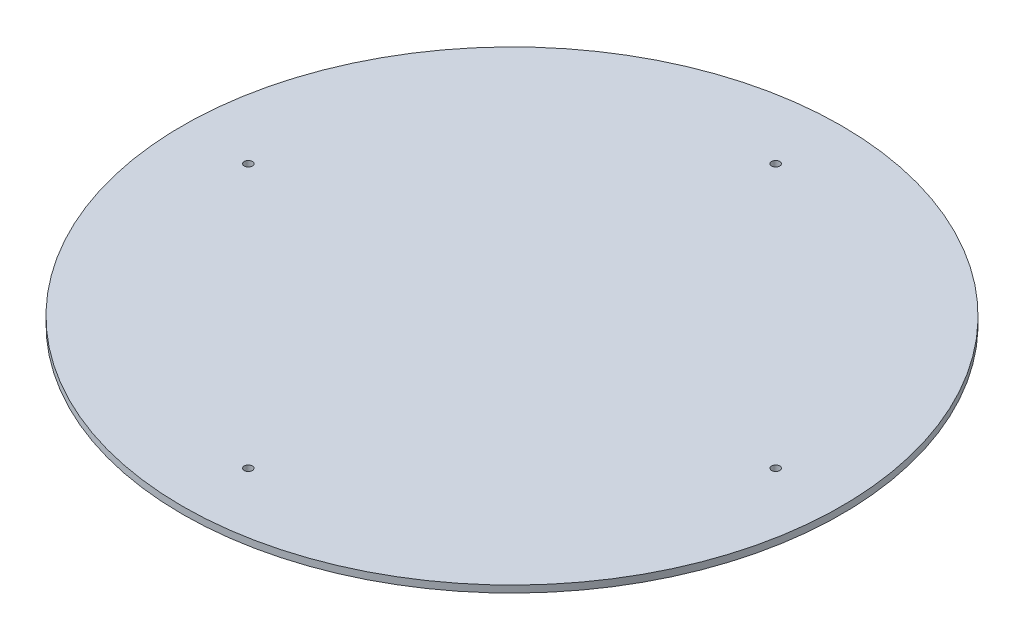
ISO-10303-21;
HEADER;
FILE_DESCRIPTION(('STEP AP214'),'2;1');
FILE_NAME('part.step','',(''),(''),'','','');
FILE_SCHEMA(('AUTOMOTIVE_DESIGN { 1 0 10303 214 1 1 1 1 }'));
ENDSEC;
DATA;
#1=APPLICATION_CONTEXT('core data for automotive mechanical design processes');
#2=APPLICATION_PROTOCOL_DEFINITION('international standard','automotive_design',2000,#1);
#3=PRODUCT_CONTEXT('',#1,'mechanical');
#4=PRODUCT('Part','Part','',(#3));
#5=PRODUCT_RELATED_PRODUCT_CATEGORY('part','',(#4));
#6=PRODUCT_DEFINITION_FORMATION('','',#4);
#7=PRODUCT_DEFINITION_CONTEXT('part definition',#1,'design');
#8=PRODUCT_DEFINITION('design','',#6,#7);
#9=PRODUCT_DEFINITION_SHAPE('','',#8);
#10=(LENGTH_UNIT() NAMED_UNIT(*) SI_UNIT(.MILLI.,.METRE.));
#11=(NAMED_UNIT(*) PLANE_ANGLE_UNIT() SI_UNIT($,.RADIAN.));
#12=(NAMED_UNIT(*) SI_UNIT($,.STERADIAN.) SOLID_ANGLE_UNIT());
#13=UNCERTAINTY_MEASURE_WITH_UNIT(LENGTH_MEASURE(1.E-05),#10,'distance_accuracy_value','');
#14=(GEOMETRIC_REPRESENTATION_CONTEXT(3) GLOBAL_UNCERTAINTY_ASSIGNED_CONTEXT((#13)) GLOBAL_UNIT_ASSIGNED_CONTEXT((#10,
#11,#12)) REPRESENTATION_CONTEXT('',''));
#15=CARTESIAN_POINT('',(0.,0.,0.));
#16=DIRECTION('',(0.,0.,1.));
#17=DIRECTION('',(1.,0.,0.));
#18=AXIS2_PLACEMENT_3D('',#15,#16,#17);
#19=CARTESIAN_POINT('',(0.,6.,0.));
#20=DIRECTION('',(0.,-1.,0.));
#21=DIRECTION('',(0.,0.,-1.));
#22=AXIS2_PLACEMENT_3D('',#19,#20,#21);
#23=CYLINDRICAL_SURFACE('',#22,285.);
#24=CARTESIAN_POINT('',(0.,6.,0.));
#25=DIRECTION('',(0.,1.,0.));
#26=DIRECTION('',(0.,0.,1.));
#27=AXIS2_PLACEMENT_3D('',#24,#25,#26);
#28=CIRCLE('',#27,285.);
#29=CARTESIAN_POINT('',(0.,6.,285.));
#30=VERTEX_POINT('',#29);
#31=EDGE_CURVE('E10',#30,#30,#28,.T.);
#32=ORIENTED_EDGE('',*,*,#31,.F.);
#33=EDGE_LOOP('',(#32));
#34=FACE_BOUND('',#33,.T.);
#35=CARTESIAN_POINT('',(0.,0.,0.));
#36=DIRECTION('',(0.,1.,0.));
#37=DIRECTION('',(0.,0.,1.));
#38=AXIS2_PLACEMENT_3D('',#35,#36,#37);
#39=CIRCLE('',#38,285.);
#40=CARTESIAN_POINT('',(0.,0.,285.));
#41=VERTEX_POINT('',#40);
#42=EDGE_CURVE('E38',#41,#41,#39,.T.);
#43=ORIENTED_EDGE('',*,*,#42,.T.);
#44=EDGE_LOOP('',(#43));
#45=FACE_BOUND('',#44,.T.);
#46=ADVANCED_FACE('F35',(#34,#45),#23,.T.);
#47=CARTESIAN_POINT('',(0.,6.,0.));
#48=DIRECTION('',(0.,1.,0.));
#49=DIRECTION('',(0.,0.,1.));
#50=AXIS2_PLACEMENT_3D('',#47,#48,#49);
#51=PLANE('',#50);
#52=CARTESIAN_POINT('',(228.04,6.,0.));
#53=DIRECTION('',(0.,1.,0.));
#54=DIRECTION('',(0.,0.,1.));
#55=AXIS2_PLACEMENT_3D('',#52,#53,#54);
#56=CIRCLE('',#55,3.49999999999999);
#57=CARTESIAN_POINT('',(228.04,6.,3.49999999999999));
#58=VERTEX_POINT('',#57);
#59=EDGE_CURVE('E65',#58,#58,#56,.T.);
#60=ORIENTED_EDGE('',*,*,#59,.F.);
#61=EDGE_LOOP('',(#60));
#62=FACE_BOUND('',#61,.T.);
#63=CARTESIAN_POINT('',(-7.96197404509788E-13,6.,228.04));
#64=DIRECTION('',(0.,1.,0.));
#65=DIRECTION('',(0.,0.,1.));
#66=AXIS2_PLACEMENT_3D('',#63,#64,#65);
#67=CIRCLE('',#66,3.49999999999999);
#68=CARTESIAN_POINT('',(-7.96197404509788E-13,6.,231.54));
#69=VERTEX_POINT('',#68);
#70=EDGE_CURVE('E59',#69,#69,#67,.T.);
#71=ORIENTED_EDGE('',*,*,#70,.F.);
#72=EDGE_LOOP('',(#71));
#73=FACE_BOUND('',#72,.T.);
#74=CARTESIAN_POINT('',(-228.04,6.,-1.59239480901958E-12));
#75=DIRECTION('',(0.,1.,0.));
#76=DIRECTION('',(0.,0.,1.));
#77=AXIS2_PLACEMENT_3D('',#74,#75,#76);
#78=CIRCLE('',#77,3.49999999999999);
#79=CARTESIAN_POINT('',(-228.04,6.,3.49999999999839));
#80=VERTEX_POINT('',#79);
#81=EDGE_CURVE('E53',#80,#80,#78,.T.);
#82=ORIENTED_EDGE('',*,*,#81,.F.);
#83=EDGE_LOOP('',(#82));
#84=FACE_BOUND('',#83,.T.);
#85=CARTESIAN_POINT('',(2.38859221352936E-12,6.,-228.04));
#86=DIRECTION('',(0.,1.,0.));
#87=DIRECTION('',(0.,0.,1.));
#88=AXIS2_PLACEMENT_3D('',#85,#86,#87);
#89=CIRCLE('',#88,3.49999999999998);
#90=CARTESIAN_POINT('',(2.38859221352936E-12,6.,-224.54));
#91=VERTEX_POINT('',#90);
#92=EDGE_CURVE('E47',#91,#91,#89,.T.);
#93=ORIENTED_EDGE('',*,*,#92,.F.);
#94=EDGE_LOOP('',(#93));
#95=FACE_BOUND('',#94,.T.);
#96=ORIENTED_EDGE('',*,*,#31,.T.);
#97=EDGE_LOOP('',(#96));
#98=FACE_BOUND('',#97,.T.);
#99=ADVANCED_FACE('F81',(#62,#73,#84,#95,#98),#51,.T.);
#100=CARTESIAN_POINT('',(0.,0.,0.));
#101=DIRECTION('',(0.,1.,0.));
#102=DIRECTION('',(0.,0.,1.));
#103=AXIS2_PLACEMENT_3D('',#100,#101,#102);
#104=PLANE('',#103);
#105=CARTESIAN_POINT('',(228.04,0.,0.));
#106=DIRECTION('',(0.,1.,0.));
#107=DIRECTION('',(0.,0.,1.));
#108=AXIS2_PLACEMENT_3D('',#105,#106,#107);
#109=CIRCLE('',#108,3.49999999999999);
#110=CARTESIAN_POINT('',(228.04,0.,3.49999999999999));
#111=VERTEX_POINT('',#110);
#112=EDGE_CURVE('E45',#111,#111,#109,.T.);
#113=ORIENTED_EDGE('',*,*,#112,.T.);
#114=EDGE_LOOP('',(#113));
#115=FACE_BOUND('',#114,.T.);
#116=CARTESIAN_POINT('',(-7.96197404509788E-13,0.,228.04));
#117=DIRECTION('',(0.,1.,0.));
#118=DIRECTION('',(0.,0.,1.));
#119=AXIS2_PLACEMENT_3D('',#116,#117,#118);
#120=CIRCLE('',#119,3.49999999999999);
#121=CARTESIAN_POINT('',(-7.96197404509788E-13,0.,231.54));
#122=VERTEX_POINT('',#121);
#123=EDGE_CURVE('E62',#122,#122,#120,.T.);
#124=ORIENTED_EDGE('',*,*,#123,.T.);
#125=EDGE_LOOP('',(#124));
#126=FACE_BOUND('',#125,.T.);
#127=CARTESIAN_POINT('',(-228.04,0.,-1.59239480901958E-12));
#128=DIRECTION('',(0.,1.,0.));
#129=DIRECTION('',(0.,0.,1.));
#130=AXIS2_PLACEMENT_3D('',#127,#128,#129);
#131=CIRCLE('',#130,3.49999999999999);
#132=CARTESIAN_POINT('',(-228.04,0.,3.49999999999839));
#133=VERTEX_POINT('',#132);
#134=EDGE_CURVE('E56',#133,#133,#131,.T.);
#135=ORIENTED_EDGE('',*,*,#134,.T.);
#136=EDGE_LOOP('',(#135));
#137=FACE_BOUND('',#136,.T.);
#138=CARTESIAN_POINT('',(2.38859221352936E-12,0.,-228.04));
#139=DIRECTION('',(0.,1.,0.));
#140=DIRECTION('',(0.,0.,1.));
#141=AXIS2_PLACEMENT_3D('',#138,#139,#140);
#142=CIRCLE('',#141,3.49999999999998);
#143=CARTESIAN_POINT('',(2.38859221352936E-12,0.,-224.54));
#144=VERTEX_POINT('',#143);
#145=EDGE_CURVE('E50',#144,#144,#142,.T.);
#146=ORIENTED_EDGE('',*,*,#145,.T.);
#147=EDGE_LOOP('',(#146));
#148=FACE_BOUND('',#147,.T.);
#149=ORIENTED_EDGE('',*,*,#42,.F.);
#150=EDGE_LOOP('',(#149));
#151=FACE_BOUND('',#150,.T.);
#152=ADVANCED_FACE('F71',(#115,#126,#137,#148,#151),#104,.F.);
#153=CARTESIAN_POINT('',(2.38859221352936E-12,0.,-228.04));
#154=DIRECTION('',(0.,1.,0.));
#155=DIRECTION('',(0.,0.,1.));
#156=AXIS2_PLACEMENT_3D('',#153,#154,#155);
#157=CYLINDRICAL_SURFACE('',#156,3.49999999999998);
#158=ORIENTED_EDGE('',*,*,#145,.F.);
#159=EDGE_LOOP('',(#158));
#160=FACE_BOUND('',#159,.T.);
#161=ORIENTED_EDGE('',*,*,#92,.T.);
#162=EDGE_LOOP('',(#161));
#163=FACE_BOUND('',#162,.T.);
#164=ADVANCED_FACE('F91',(#160,#163),#157,.F.);
#165=CARTESIAN_POINT('',(-228.04,0.,-1.59239480901958E-12));
#166=DIRECTION('',(0.,1.,0.));
#167=DIRECTION('',(0.,0.,1.));
#168=AXIS2_PLACEMENT_3D('',#165,#166,#167);
#169=CYLINDRICAL_SURFACE('',#168,3.49999999999999);
#170=ORIENTED_EDGE('',*,*,#134,.F.);
#171=EDGE_LOOP('',(#170));
#172=FACE_BOUND('',#171,.T.);
#173=ORIENTED_EDGE('',*,*,#81,.T.);
#174=EDGE_LOOP('',(#173));
#175=FACE_BOUND('',#174,.T.);
#176=ADVANCED_FACE('F93',(#172,#175),#169,.F.);
#177=CARTESIAN_POINT('',(-7.96197404509788E-13,0.,228.04));
#178=DIRECTION('',(0.,1.,0.));
#179=DIRECTION('',(0.,0.,1.));
#180=AXIS2_PLACEMENT_3D('',#177,#178,#179);
#181=CYLINDRICAL_SURFACE('',#180,3.49999999999999);
#182=ORIENTED_EDGE('',*,*,#123,.F.);
#183=EDGE_LOOP('',(#182));
#184=FACE_BOUND('',#183,.T.);
#185=ORIENTED_EDGE('',*,*,#70,.T.);
#186=EDGE_LOOP('',(#185));
#187=FACE_BOUND('',#186,.T.);
#188=ADVANCED_FACE('F77',(#184,#187),#181,.F.);
#189=CARTESIAN_POINT('',(228.04,0.,0.));
#190=DIRECTION('',(0.,1.,0.));
#191=DIRECTION('',(0.,0.,1.));
#192=AXIS2_PLACEMENT_3D('',#189,#190,#191);
#193=CYLINDRICAL_SURFACE('',#192,3.49999999999999);
#194=ORIENTED_EDGE('',*,*,#112,.F.);
#195=EDGE_LOOP('',(#194));
#196=FACE_BOUND('',#195,.T.);
#197=ORIENTED_EDGE('',*,*,#59,.T.);
#198=EDGE_LOOP('',(#197));
#199=FACE_BOUND('',#198,.T.);
#200=ADVANCED_FACE('F74',(#196,#199),#193,.F.);
#201=CLOSED_SHELL('',(#46,#99,#152,#164,#176,#188,#200));
#202=MANIFOLD_SOLID_BREP('B2',#201);
#203=ADVANCED_BREP_SHAPE_REPRESENTATION('',(#18,#202),#14);
#204=SHAPE_DEFINITION_REPRESENTATION(#9,#203);
ENDSEC;
END-ISO-10303-21;
